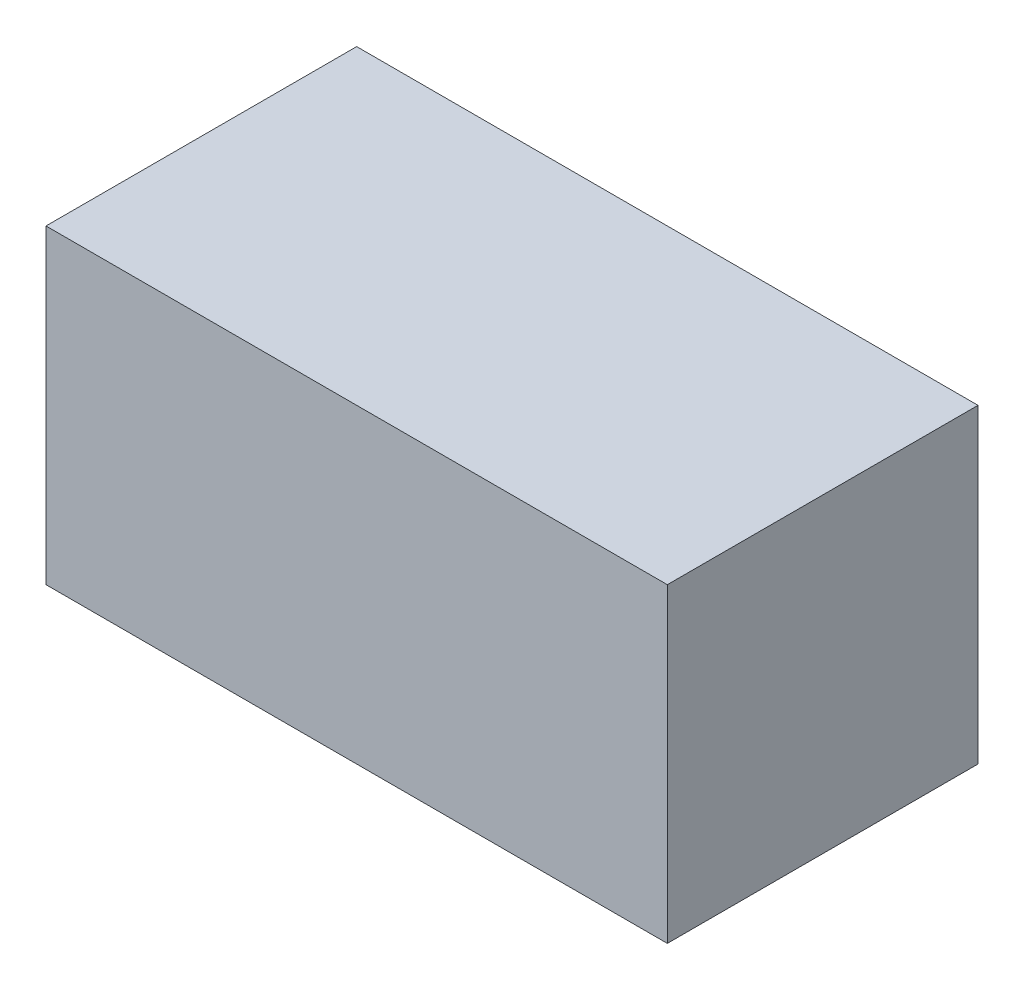
ISO-10303-21;
HEADER;
FILE_DESCRIPTION(('STEP AP214'),'2;1');
FILE_NAME('part.step','',(''),(''),'','','');
FILE_SCHEMA(('AUTOMOTIVE_DESIGN { 1 0 10303 214 1 1 1 1 }'));
ENDSEC;
DATA;
#1=APPLICATION_CONTEXT('core data for automotive mechanical design processes');
#2=APPLICATION_PROTOCOL_DEFINITION('international standard','automotive_design',2000,#1);
#3=PRODUCT_CONTEXT('',#1,'mechanical');
#4=PRODUCT('Part','Part','',(#3));
#5=PRODUCT_RELATED_PRODUCT_CATEGORY('part','',(#4));
#6=PRODUCT_DEFINITION_FORMATION('','',#4);
#7=PRODUCT_DEFINITION_CONTEXT('part definition',#1,'design');
#8=PRODUCT_DEFINITION('design','',#6,#7);
#9=PRODUCT_DEFINITION_SHAPE('','',#8);
#10=(LENGTH_UNIT() NAMED_UNIT(*) SI_UNIT(.MILLI.,.METRE.));
#11=(NAMED_UNIT(*) PLANE_ANGLE_UNIT() SI_UNIT($,.RADIAN.));
#12=(NAMED_UNIT(*) SI_UNIT($,.STERADIAN.) SOLID_ANGLE_UNIT());
#13=UNCERTAINTY_MEASURE_WITH_UNIT(LENGTH_MEASURE(1.E-05),#10,'distance_accuracy_value','');
#14=(GEOMETRIC_REPRESENTATION_CONTEXT(3) GLOBAL_UNCERTAINTY_ASSIGNED_CONTEXT((#13)) GLOBAL_UNIT_ASSIGNED_CONTEXT((#10,
#11,#12)) REPRESENTATION_CONTEXT('',''));
#15=CARTESIAN_POINT('',(0.,0.,0.));
#16=DIRECTION('',(0.,0.,1.));
#17=DIRECTION('',(1.,0.,0.));
#18=AXIS2_PLACEMENT_3D('',#15,#16,#17);
#19=CARTESIAN_POINT('',(10.,-5.,10.));
#20=DIRECTION('',(-1.,0.,0.));
#21=DIRECTION('',(0.,0.,1.));
#22=AXIS2_PLACEMENT_3D('',#19,#20,#21);
#23=PLANE('',#22);
#24=DIRECTION('',(0.,1.,0.));
#25=VECTOR('',#24,1.);
#26=CARTESIAN_POINT('',(10.,-5.,0.));
#27=LINE('',#26,#25);
#28=CARTESIAN_POINT('',(10.,-5.,0.));
#29=VERTEX_POINT('',#28);
#30=CARTESIAN_POINT('',(10.,5.,0.));
#31=VERTEX_POINT('',#30);
#32=EDGE_CURVE('E99',#29,#31,#27,.T.);
#33=ORIENTED_EDGE('',*,*,#32,.T.);
#34=DIRECTION('',(0.,0.,-1.));
#35=VECTOR('',#34,1.);
#36=CARTESIAN_POINT('',(10.,5.,10.));
#37=LINE('',#36,#35);
#38=CARTESIAN_POINT('',(10.,5.,10.));
#39=VERTEX_POINT('',#38);
#40=EDGE_CURVE('E11',#39,#31,#37,.T.);
#41=ORIENTED_EDGE('',*,*,#40,.F.);
#42=DIRECTION('',(0.,1.,0.));
#43=VECTOR('',#42,1.);
#44=CARTESIAN_POINT('',(10.,-5.,10.));
#45=LINE('',#44,#43);
#46=CARTESIAN_POINT('',(10.,-5.,10.));
#47=VERTEX_POINT('',#46);
#48=EDGE_CURVE('E87',#47,#39,#45,.T.);
#49=ORIENTED_EDGE('',*,*,#48,.F.);
#50=DIRECTION('',(0.,0.,-1.));
#51=VECTOR('',#50,1.);
#52=CARTESIAN_POINT('',(10.,-5.,10.));
#53=LINE('',#52,#51);
#54=EDGE_CURVE('E95',#47,#29,#53,.T.);
#55=ORIENTED_EDGE('',*,*,#54,.T.);
#56=EDGE_LOOP('',(#33,#41,#49,#55));
#57=FACE_BOUND('',#56,.T.);
#58=ADVANCED_FACE('F36',(#57),#23,.F.);
#59=CARTESIAN_POINT('',(-10.,5.,10.));
#60=DIRECTION('',(0.,-1.,0.));
#61=DIRECTION('',(0.,0.,-1.));
#62=AXIS2_PLACEMENT_3D('',#59,#60,#61);
#63=PLANE('',#62);
#64=DIRECTION('',(-1.,0.,0.));
#65=VECTOR('',#64,1.);
#66=CARTESIAN_POINT('',(-10.,5.,0.));
#67=LINE('',#66,#65);
#68=CARTESIAN_POINT('',(-10.,5.,0.));
#69=VERTEX_POINT('',#68);
#70=EDGE_CURVE('E91',#31,#69,#67,.T.);
#71=ORIENTED_EDGE('',*,*,#70,.T.);
#72=DIRECTION('',(0.,0.,-1.));
#73=VECTOR('',#72,1.);
#74=CARTESIAN_POINT('',(-10.,5.,10.));
#75=LINE('',#74,#73);
#76=CARTESIAN_POINT('',(-10.,5.,10.));
#77=VERTEX_POINT('',#76);
#78=EDGE_CURVE('E44',#77,#69,#75,.T.);
#79=ORIENTED_EDGE('',*,*,#78,.F.);
#80=DIRECTION('',(-1.,0.,0.));
#81=VECTOR('',#80,1.);
#82=CARTESIAN_POINT('',(-10.,5.,10.));
#83=LINE('',#82,#81);
#84=EDGE_CURVE('E82',#39,#77,#83,.T.);
#85=ORIENTED_EDGE('',*,*,#84,.F.);
#86=ORIENTED_EDGE('',*,*,#40,.T.);
#87=EDGE_LOOP('',(#71,#79,#85,#86));
#88=FACE_BOUND('',#87,.T.);
#89=ADVANCED_FACE('F90',(#88),#63,.F.);
#90=CARTESIAN_POINT('',(-10.,-5.,10.));
#91=DIRECTION('',(1.,0.,0.));
#92=DIRECTION('',(0.,0.,-1.));
#93=AXIS2_PLACEMENT_3D('',#90,#91,#92);
#94=PLANE('',#93);
#95=DIRECTION('',(0.,-1.,0.));
#96=VECTOR('',#95,1.);
#97=CARTESIAN_POINT('',(-10.,-5.,0.));
#98=LINE('',#97,#96);
#99=CARTESIAN_POINT('',(-10.,-5.,0.));
#100=VERTEX_POINT('',#99);
#101=EDGE_CURVE('E69',#69,#100,#98,.T.);
#102=ORIENTED_EDGE('',*,*,#101,.T.);
#103=DIRECTION('',(0.,0.,-1.));
#104=VECTOR('',#103,1.);
#105=CARTESIAN_POINT('',(-10.,-5.,10.));
#106=LINE('',#105,#104);
#107=CARTESIAN_POINT('',(-10.,-5.,10.));
#108=VERTEX_POINT('',#107);
#109=EDGE_CURVE('E92',#108,#100,#106,.T.);
#110=ORIENTED_EDGE('',*,*,#109,.F.);
#111=DIRECTION('',(0.,-1.,0.));
#112=VECTOR('',#111,1.);
#113=CARTESIAN_POINT('',(-10.,-5.,10.));
#114=LINE('',#113,#112);
#115=EDGE_CURVE('E85',#77,#108,#114,.T.);
#116=ORIENTED_EDGE('',*,*,#115,.F.);
#117=ORIENTED_EDGE('',*,*,#78,.T.);
#118=EDGE_LOOP('',(#102,#110,#116,#117));
#119=FACE_BOUND('',#118,.T.);
#120=ADVANCED_FACE('F93',(#119),#94,.F.);
#121=CARTESIAN_POINT('',(-10.,-5.,10.));
#122=DIRECTION('',(0.,1.,0.));
#123=DIRECTION('',(0.,0.,1.));
#124=AXIS2_PLACEMENT_3D('',#121,#122,#123);
#125=PLANE('',#124);
#126=DIRECTION('',(1.,0.,0.));
#127=VECTOR('',#126,1.);
#128=CARTESIAN_POINT('',(-10.,-5.,0.));
#129=LINE('',#128,#127);
#130=EDGE_CURVE('E75',#100,#29,#129,.T.);
#131=ORIENTED_EDGE('',*,*,#130,.T.);
#132=ORIENTED_EDGE('',*,*,#54,.F.);
#133=DIRECTION('',(1.,0.,0.));
#134=VECTOR('',#133,1.);
#135=CARTESIAN_POINT('',(-10.,-5.,10.));
#136=LINE('',#135,#134);
#137=EDGE_CURVE('E52',#108,#47,#136,.T.);
#138=ORIENTED_EDGE('',*,*,#137,.F.);
#139=ORIENTED_EDGE('',*,*,#109,.T.);
#140=EDGE_LOOP('',(#131,#132,#138,#139));
#141=FACE_BOUND('',#140,.T.);
#142=ADVANCED_FACE('F106',(#141),#125,.F.);
#143=CARTESIAN_POINT('',(0.,0.,10.));
#144=DIRECTION('',(0.,0.,-1.));
#145=DIRECTION('',(-1.,0.,0.));
#146=AXIS2_PLACEMENT_3D('',#143,#144,#145);
#147=PLANE('',#146);
#148=ORIENTED_EDGE('',*,*,#48,.T.);
#149=ORIENTED_EDGE('',*,*,#84,.T.);
#150=ORIENTED_EDGE('',*,*,#115,.T.);
#151=ORIENTED_EDGE('',*,*,#137,.T.);
#152=EDGE_LOOP('',(#148,#149,#150,#151));
#153=FACE_BOUND('',#152,.T.);
#154=ADVANCED_FACE('F83',(#153),#147,.F.);
#155=CARTESIAN_POINT('',(0.,0.,0.));
#156=DIRECTION('',(0.,0.,-1.));
#157=DIRECTION('',(-1.,0.,0.));
#158=AXIS2_PLACEMENT_3D('',#155,#156,#157);
#159=PLANE('',#158);
#160=ORIENTED_EDGE('',*,*,#32,.F.);
#161=ORIENTED_EDGE('',*,*,#130,.F.);
#162=ORIENTED_EDGE('',*,*,#101,.F.);
#163=ORIENTED_EDGE('',*,*,#70,.F.);
#164=EDGE_LOOP('',(#160,#161,#162,#163));
#165=FACE_BOUND('',#164,.T.);
#166=ADVANCED_FACE('F109',(#165),#159,.T.);
#167=CLOSED_SHELL('',(#58,#89,#120,#142,#154,#166));
#168=MANIFOLD_SOLID_BREP('B2',#167);
#169=ADVANCED_BREP_SHAPE_REPRESENTATION('',(#18,#168),#14);
#170=SHAPE_DEFINITION_REPRESENTATION(#9,#169);
ENDSEC;
END-ISO-10303-21;
